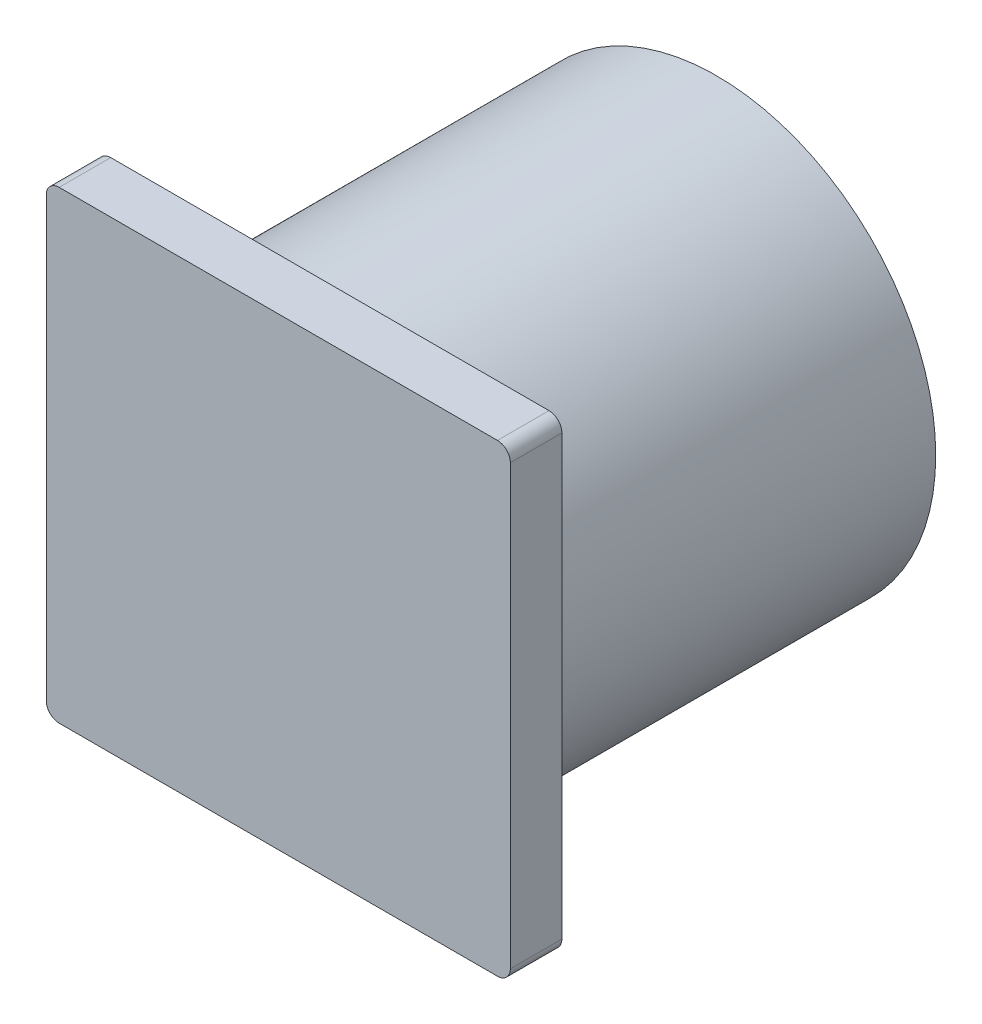
ISO-10303-21;
HEADER;
FILE_DESCRIPTION(('STEP AP214'),'2;1');
FILE_NAME('part.step','',(''),(''),'','','');
FILE_SCHEMA(('AUTOMOTIVE_DESIGN { 1 0 10303 214 1 1 1 1 }'));
ENDSEC;
DATA;
#1=APPLICATION_CONTEXT('core data for automotive mechanical design processes');
#2=APPLICATION_PROTOCOL_DEFINITION('international standard','automotive_design',2000,#1);
#3=PRODUCT_CONTEXT('',#1,'mechanical');
#4=PRODUCT('Part','Part','',(#3));
#5=PRODUCT_RELATED_PRODUCT_CATEGORY('part','',(#4));
#6=PRODUCT_DEFINITION_FORMATION('','',#4);
#7=PRODUCT_DEFINITION_CONTEXT('part definition',#1,'design');
#8=PRODUCT_DEFINITION('design','',#6,#7);
#9=PRODUCT_DEFINITION_SHAPE('','',#8);
#10=(LENGTH_UNIT() NAMED_UNIT(*) SI_UNIT(.MILLI.,.METRE.));
#11=(NAMED_UNIT(*) PLANE_ANGLE_UNIT() SI_UNIT($,.RADIAN.));
#12=(NAMED_UNIT(*) SI_UNIT($,.STERADIAN.) SOLID_ANGLE_UNIT());
#13=UNCERTAINTY_MEASURE_WITH_UNIT(LENGTH_MEASURE(1.E-05),#10,'distance_accuracy_value','');
#14=(GEOMETRIC_REPRESENTATION_CONTEXT(3) GLOBAL_UNCERTAINTY_ASSIGNED_CONTEXT((#13)) GLOBAL_UNIT_ASSIGNED_CONTEXT((#10,
#11,#12)) REPRESENTATION_CONTEXT('',''));
#15=CARTESIAN_POINT('',(0.,0.,0.));
#16=DIRECTION('',(0.,0.,1.));
#17=DIRECTION('',(1.,0.,0.));
#18=AXIS2_PLACEMENT_3D('',#15,#16,#17);
#19=CARTESIAN_POINT('',(0.,0.,150.));
#20=DIRECTION('',(0.,0.,1.));
#21=DIRECTION('',(1.,0.,0.));
#22=AXIS2_PLACEMENT_3D('',#19,#20,#21);
#23=PLANE('',#22);
#24=DIRECTION('',(-1.,0.,0.));
#25=VECTOR('',#24,1.);
#26=CARTESIAN_POINT('',(-90.,90.,150.));
#27=LINE('',#26,#25);
#28=CARTESIAN_POINT('',(84.9999999999999,90.,150.));
#29=VERTEX_POINT('',#28);
#30=CARTESIAN_POINT('',(0.,90.,150.));
#31=VERTEX_POINT('',#30);
#32=EDGE_CURVE('E197',#29,#31,#27,.T.);
#33=ORIENTED_EDGE('',*,*,#32,.F.);
#34=CARTESIAN_POINT('',(85.,85.,150.));
#35=DIRECTION('',(0.,0.,1.));
#36=DIRECTION('',(1.,0.,0.));
#37=AXIS2_PLACEMENT_3D('',#34,#35,#36);
#38=CIRCLE('',#37,5.);
#39=CARTESIAN_POINT('',(90.,85.,150.));
#40=VERTEX_POINT('',#39);
#41=EDGE_CURVE('E174',#29,#40,#38,.F.);
#42=ORIENTED_EDGE('',*,*,#41,.T.);
#43=DIRECTION('',(0.,1.,0.));
#44=VECTOR('',#43,1.);
#45=CARTESIAN_POINT('',(90.,90.,150.));
#46=LINE('',#45,#44);
#47=CARTESIAN_POINT('',(90.,0.,150.));
#48=VERTEX_POINT('',#47);
#49=EDGE_CURVE('E195',#48,#40,#46,.T.);
#50=ORIENTED_EDGE('',*,*,#49,.F.);
#51=CARTESIAN_POINT('',(0.,0.,150.));
#52=DIRECTION('',(0.,0.,1.));
#53=DIRECTION('',(1.,0.,0.));
#54=AXIS2_PLACEMENT_3D('',#51,#52,#53);
#55=CIRCLE('',#54,90.);
#56=EDGE_CURVE('E134',#48,#31,#55,.T.);
#57=ORIENTED_EDGE('',*,*,#56,.T.);
#58=EDGE_LOOP('',(#33,#42,#50,#57));
#59=FACE_BOUND('',#58,.T.);
#60=ADVANCED_FACE('F34',(#59),#23,.F.);
#61=DIRECTION('',(0.,-1.,0.));
#62=VECTOR('',#61,1.);
#63=CARTESIAN_POINT('',(-90.,90.,150.));
#64=LINE('',#63,#62);
#65=CARTESIAN_POINT('',(-90.,85.,150.));
#66=VERTEX_POINT('',#65);
#67=CARTESIAN_POINT('',(-90.,0.,150.));
#68=VERTEX_POINT('',#67);
#69=EDGE_CURVE('E112',#66,#68,#64,.T.);
#70=ORIENTED_EDGE('',*,*,#69,.F.);
#71=CARTESIAN_POINT('',(-85.,85.,150.));
#72=DIRECTION('',(0.,0.,1.));
#73=DIRECTION('',(1.,0.,0.));
#74=AXIS2_PLACEMENT_3D('',#71,#72,#73);
#75=CIRCLE('',#74,5.);
#76=CARTESIAN_POINT('',(-85.,90.,150.));
#77=VERTEX_POINT('',#76);
#78=EDGE_CURVE('E156',#66,#77,#75,.F.);
#79=ORIENTED_EDGE('',*,*,#78,.T.);
#80=EDGE_CURVE('E129',#31,#77,#27,.T.);
#81=ORIENTED_EDGE('',*,*,#80,.F.);
#82=CARTESIAN_POINT('',(0.,0.,150.));
#83=DIRECTION('',(0.,0.,1.));
#84=DIRECTION('',(1.,0.,0.));
#85=AXIS2_PLACEMENT_3D('',#82,#83,#84);
#86=CIRCLE('',#85,90.);
#87=EDGE_CURVE('E126',#31,#68,#86,.T.);
#88=ORIENTED_EDGE('',*,*,#87,.T.);
#89=EDGE_LOOP('',(#70,#79,#81,#88));
#90=FACE_BOUND('',#89,.T.);
#91=ADVANCED_FACE('F127',(#90),#23,.F.);
#92=DIRECTION('',(1.,0.,0.));
#93=VECTOR('',#92,1.);
#94=CARTESIAN_POINT('',(-89.9999999999999,-90.,150.));
#95=LINE('',#94,#93);
#96=CARTESIAN_POINT('',(-84.9999999999999,-90.,150.));
#97=VERTEX_POINT('',#96);
#98=CARTESIAN_POINT('',(0.,-90.,150.));
#99=VERTEX_POINT('',#98);
#100=EDGE_CURVE('E199',#97,#99,#95,.T.);
#101=ORIENTED_EDGE('',*,*,#100,.F.);
#102=CARTESIAN_POINT('',(-84.9999999999999,-85.,150.));
#103=DIRECTION('',(0.,0.,1.));
#104=DIRECTION('',(1.,0.,0.));
#105=AXIS2_PLACEMENT_3D('',#102,#103,#104);
#106=CIRCLE('',#105,5.);
#107=CARTESIAN_POINT('',(-89.9999999999999,-85.,150.));
#108=VERTEX_POINT('',#107);
#109=EDGE_CURVE('E141',#97,#108,#106,.F.);
#110=ORIENTED_EDGE('',*,*,#109,.T.);
#111=EDGE_CURVE('E116',#68,#108,#64,.T.);
#112=ORIENTED_EDGE('',*,*,#111,.F.);
#113=CARTESIAN_POINT('',(0.,0.,150.));
#114=DIRECTION('',(0.,0.,1.));
#115=DIRECTION('',(1.,0.,0.));
#116=AXIS2_PLACEMENT_3D('',#113,#114,#115);
#117=CIRCLE('',#116,90.);
#118=EDGE_CURVE('E135',#68,#99,#117,.T.);
#119=ORIENTED_EDGE('',*,*,#118,.T.);
#120=EDGE_LOOP('',(#101,#110,#112,#119));
#121=FACE_BOUND('',#120,.T.);
#122=ADVANCED_FACE('F140',(#121),#23,.F.);
#123=CARTESIAN_POINT('',(0.,0.,150.));
#124=DIRECTION('',(0.,0.,-1.));
#125=DIRECTION('',(-1.,0.,0.));
#126=AXIS2_PLACEMENT_3D('',#123,#124,#125);
#127=CYLINDRICAL_SURFACE('',#126,85.);
#128=CARTESIAN_POINT('',(0.,0.,145.));
#129=DIRECTION('',(0.,0.,1.));
#130=DIRECTION('',(1.,0.,0.));
#131=AXIS2_PLACEMENT_3D('',#128,#129,#130);
#132=CIRCLE('',#131,85.);
#133=CARTESIAN_POINT('',(85.,0.,145.));
#134=VERTEX_POINT('',#133);
#135=EDGE_CURVE('E152',#134,#134,#132,.F.);
#136=ORIENTED_EDGE('',*,*,#135,.T.);
#137=EDGE_LOOP('',(#136));
#138=FACE_BOUND('',#137,.T.);
#139=CARTESIAN_POINT('',(0.,0.,0.));
#140=DIRECTION('',(0.,0.,1.));
#141=DIRECTION('',(1.,0.,0.));
#142=AXIS2_PLACEMENT_3D('',#139,#140,#141);
#143=CIRCLE('',#142,85.);
#144=CARTESIAN_POINT('',(85.,0.,0.));
#145=VERTEX_POINT('',#144);
#146=EDGE_CURVE('E147',#145,#145,#143,.T.);
#147=ORIENTED_EDGE('',*,*,#146,.T.);
#148=EDGE_LOOP('',(#147));
#149=FACE_BOUND('',#148,.T.);
#150=ADVANCED_FACE('F246',(#138,#149),#127,.T.);
#151=CARTESIAN_POINT('',(0.,0.,0.));
#152=DIRECTION('',(0.,0.,1.));
#153=DIRECTION('',(1.,0.,0.));
#154=AXIS2_PLACEMENT_3D('',#151,#152,#153);
#155=PLANE('',#154);
#156=ORIENTED_EDGE('',*,*,#146,.F.);
#157=EDGE_LOOP('',(#156));
#158=FACE_BOUND('',#157,.T.);
#159=ADVANCED_FACE('F250',(#158),#155,.F.);
#160=CARTESIAN_POINT('',(-90.,90.,170.));
#161=DIRECTION('',(1.,0.,0.));
#162=DIRECTION('',(0.,1.,0.));
#163=AXIS2_PLACEMENT_3D('',#160,#161,#162);
#164=PLANE('',#163);
#165=ORIENTED_EDGE('',*,*,#111,.T.);
#166=DIRECTION('',(0.,0.,-1.));
#167=VECTOR('',#166,1.);
#168=CARTESIAN_POINT('',(-89.9999999999999,-85.,170.));
#169=LINE('',#168,#167);
#170=CARTESIAN_POINT('',(-89.9999999999999,-85.,170.));
#171=VERTEX_POINT('',#170);
#172=EDGE_CURVE('E167',#108,#171,#169,.F.);
#173=ORIENTED_EDGE('',*,*,#172,.T.);
#174=DIRECTION('',(0.,-1.,0.));
#175=VECTOR('',#174,1.);
#176=CARTESIAN_POINT('',(-90.,90.,170.));
#177=LINE('',#176,#175);
#178=CARTESIAN_POINT('',(-90.,85.,170.));
#179=VERTEX_POINT('',#178);
#180=EDGE_CURVE('E201',#179,#171,#177,.T.);
#181=ORIENTED_EDGE('',*,*,#180,.F.);
#182=DIRECTION('',(0.,0.,-1.));
#183=VECTOR('',#182,1.);
#184=CARTESIAN_POINT('',(-90.,85.,170.));
#185=LINE('',#184,#183);
#186=EDGE_CURVE('E120',#179,#66,#185,.T.);
#187=ORIENTED_EDGE('',*,*,#186,.T.);
#188=ORIENTED_EDGE('',*,*,#69,.T.);
#189=EDGE_LOOP('',(#165,#173,#181,#187,#188));
#190=FACE_BOUND('',#189,.T.);
#191=ADVANCED_FACE('F114',(#190),#164,.F.);
#192=CARTESIAN_POINT('',(-89.9999999999999,-90.,170.));
#193=DIRECTION('',(0.,1.,0.));
#194=DIRECTION('',(-1.,0.,0.));
#195=AXIS2_PLACEMENT_3D('',#192,#193,#194);
#196=PLANE('',#195);
#197=CARTESIAN_POINT('',(84.9999999999999,-90.,150.));
#198=VERTEX_POINT('',#197);
#199=EDGE_CURVE('E122',#99,#198,#95,.T.);
#200=ORIENTED_EDGE('',*,*,#199,.T.);
#201=DIRECTION('',(0.,0.,-1.));
#202=VECTOR('',#201,1.);
#203=CARTESIAN_POINT('',(85.,-90.,170.));
#204=LINE('',#203,#202);
#205=CARTESIAN_POINT('',(84.9999999999999,-90.,170.));
#206=VERTEX_POINT('',#205);
#207=EDGE_CURVE('E42',#198,#206,#204,.F.);
#208=ORIENTED_EDGE('',*,*,#207,.T.);
#209=DIRECTION('',(1.,0.,0.));
#210=VECTOR('',#209,1.);
#211=CARTESIAN_POINT('',(-89.9999999999999,-90.,170.));
#212=LINE('',#211,#210);
#213=CARTESIAN_POINT('',(-84.9999999999999,-90.,170.));
#214=VERTEX_POINT('',#213);
#215=EDGE_CURVE('E209',#214,#206,#212,.T.);
#216=ORIENTED_EDGE('',*,*,#215,.F.);
#217=DIRECTION('',(0.,0.,-1.));
#218=VECTOR('',#217,1.);
#219=CARTESIAN_POINT('',(-84.9999999999999,-90.,170.));
#220=LINE('',#219,#218);
#221=EDGE_CURVE('E163',#214,#97,#220,.T.);
#222=ORIENTED_EDGE('',*,*,#221,.T.);
#223=ORIENTED_EDGE('',*,*,#100,.T.);
#224=EDGE_LOOP('',(#200,#208,#216,#222,#223));
#225=FACE_BOUND('',#224,.T.);
#226=ADVANCED_FACE('F220',(#225),#196,.F.);
#227=CARTESIAN_POINT('',(90.,90.,170.));
#228=DIRECTION('',(-1.,0.,0.));
#229=DIRECTION('',(0.,-1.,0.));
#230=AXIS2_PLACEMENT_3D('',#227,#228,#229);
#231=PLANE('',#230);
#232=DIRECTION('',(0.,1.,0.));
#233=VECTOR('',#232,1.);
#234=CARTESIAN_POINT('',(90.,90.,170.));
#235=LINE('',#234,#233);
#236=CARTESIAN_POINT('',(90.,-84.9999999999999,170.));
#237=VERTEX_POINT('',#236);
#238=CARTESIAN_POINT('',(90.,85.,170.));
#239=VERTEX_POINT('',#238);
#240=EDGE_CURVE('E190',#237,#239,#235,.T.);
#241=ORIENTED_EDGE('',*,*,#240,.F.);
#242=DIRECTION('',(0.,0.,-1.));
#243=VECTOR('',#242,1.);
#244=CARTESIAN_POINT('',(90.,-85.,170.));
#245=LINE('',#244,#243);
#246=CARTESIAN_POINT('',(90.,-84.9999999999999,150.));
#247=VERTEX_POINT('',#246);
#248=EDGE_CURVE('E181',#237,#247,#245,.T.);
#249=ORIENTED_EDGE('',*,*,#248,.T.);
#250=EDGE_CURVE('E189',#247,#48,#46,.T.);
#251=ORIENTED_EDGE('',*,*,#250,.T.);
#252=ORIENTED_EDGE('',*,*,#49,.T.);
#253=DIRECTION('',(0.,0.,-1.));
#254=VECTOR('',#253,1.);
#255=CARTESIAN_POINT('',(90.,85.,170.));
#256=LINE('',#255,#254);
#257=EDGE_CURVE('E176',#40,#239,#256,.F.);
#258=ORIENTED_EDGE('',*,*,#257,.T.);
#259=EDGE_LOOP('',(#241,#249,#251,#252,#258));
#260=FACE_BOUND('',#259,.T.);
#261=ADVANCED_FACE('F187',(#260),#231,.F.);
#262=CARTESIAN_POINT('',(-90.,90.,170.));
#263=DIRECTION('',(0.,-1.,0.));
#264=DIRECTION('',(1.,0.,0.));
#265=AXIS2_PLACEMENT_3D('',#262,#263,#264);
#266=PLANE('',#265);
#267=DIRECTION('',(-1.,0.,0.));
#268=VECTOR('',#267,1.);
#269=CARTESIAN_POINT('',(-90.,90.,170.));
#270=LINE('',#269,#268);
#271=CARTESIAN_POINT('',(84.9999999999999,90.,170.));
#272=VERTEX_POINT('',#271);
#273=CARTESIAN_POINT('',(-85.,90.,170.));
#274=VERTEX_POINT('',#273);
#275=EDGE_CURVE('E203',#272,#274,#270,.T.);
#276=ORIENTED_EDGE('',*,*,#275,.F.);
#277=DIRECTION('',(0.,0.,-1.));
#278=VECTOR('',#277,1.);
#279=CARTESIAN_POINT('',(85.,90.,170.));
#280=LINE('',#279,#278);
#281=EDGE_CURVE('E171',#272,#29,#280,.T.);
#282=ORIENTED_EDGE('',*,*,#281,.T.);
#283=ORIENTED_EDGE('',*,*,#32,.T.);
#284=ORIENTED_EDGE('',*,*,#80,.T.);
#285=DIRECTION('',(0.,0.,-1.));
#286=VECTOR('',#285,1.);
#287=CARTESIAN_POINT('',(-85.,90.,170.));
#288=LINE('',#287,#286);
#289=EDGE_CURVE('E158',#77,#274,#288,.F.);
#290=ORIENTED_EDGE('',*,*,#289,.T.);
#291=EDGE_LOOP('',(#276,#282,#283,#284,#290));
#292=FACE_BOUND('',#291,.T.);
#293=ADVANCED_FACE('F228',(#292),#266,.F.);
#294=CARTESIAN_POINT('',(0.,0.,170.));
#295=DIRECTION('',(0.,0.,1.));
#296=DIRECTION('',(1.,0.,0.));
#297=AXIS2_PLACEMENT_3D('',#294,#295,#296);
#298=PLANE('',#297);
#299=ORIENTED_EDGE('',*,*,#215,.T.);
#300=CARTESIAN_POINT('',(85.,-85.,170.));
#301=DIRECTION('',(0.,0.,1.));
#302=DIRECTION('',(1.,0.,0.));
#303=AXIS2_PLACEMENT_3D('',#300,#301,#302);
#304=CIRCLE('',#303,5.);
#305=EDGE_CURVE('E11',#206,#237,#304,.T.);
#306=ORIENTED_EDGE('',*,*,#305,.T.);
#307=ORIENTED_EDGE('',*,*,#240,.T.);
#308=CARTESIAN_POINT('',(85.,85.,170.));
#309=DIRECTION('',(0.,0.,1.));
#310=DIRECTION('',(1.,0.,0.));
#311=AXIS2_PLACEMENT_3D('',#308,#309,#310);
#312=CIRCLE('',#311,5.);
#313=EDGE_CURVE('E179',#239,#272,#312,.T.);
#314=ORIENTED_EDGE('',*,*,#313,.T.);
#315=ORIENTED_EDGE('',*,*,#275,.T.);
#316=CARTESIAN_POINT('',(-85.,85.,170.));
#317=DIRECTION('',(0.,0.,1.));
#318=DIRECTION('',(1.,0.,0.));
#319=AXIS2_PLACEMENT_3D('',#316,#317,#318);
#320=CIRCLE('',#319,5.);
#321=EDGE_CURVE('E161',#274,#179,#320,.T.);
#322=ORIENTED_EDGE('',*,*,#321,.T.);
#323=ORIENTED_EDGE('',*,*,#180,.T.);
#324=CARTESIAN_POINT('',(-84.9999999999999,-85.,170.));
#325=DIRECTION('',(0.,0.,1.));
#326=DIRECTION('',(1.,0.,0.));
#327=AXIS2_PLACEMENT_3D('',#324,#325,#326);
#328=CIRCLE('',#327,5.);
#329=EDGE_CURVE('E169',#171,#214,#328,.T.);
#330=ORIENTED_EDGE('',*,*,#329,.T.);
#331=EDGE_LOOP('',(#299,#306,#307,#314,#315,#322,#323,#330));
#332=FACE_BOUND('',#331,.T.);
#333=ADVANCED_FACE('F215',(#332),#298,.T.);
#334=ORIENTED_EDGE('',*,*,#250,.F.);
#335=CARTESIAN_POINT('',(85.,-85.,150.));
#336=DIRECTION('',(0.,0.,1.));
#337=DIRECTION('',(1.,0.,0.));
#338=AXIS2_PLACEMENT_3D('',#335,#336,#337);
#339=CIRCLE('',#338,5.);
#340=EDGE_CURVE('E56',#247,#198,#339,.F.);
#341=ORIENTED_EDGE('',*,*,#340,.T.);
#342=ORIENTED_EDGE('',*,*,#199,.F.);
#343=CARTESIAN_POINT('',(0.,0.,150.));
#344=DIRECTION('',(0.,0.,1.));
#345=DIRECTION('',(1.,0.,0.));
#346=AXIS2_PLACEMENT_3D('',#343,#344,#345);
#347=CIRCLE('',#346,90.);
#348=EDGE_CURVE('E145',#99,#48,#347,.T.);
#349=ORIENTED_EDGE('',*,*,#348,.T.);
#350=EDGE_LOOP('',(#334,#341,#342,#349));
#351=FACE_BOUND('',#350,.T.);
#352=ADVANCED_FACE('F193',(#351),#23,.F.);
#353=CARTESIAN_POINT('',(0.,0.,145.));
#354=DIRECTION('',(0.,0.,1.));
#355=DIRECTION('',(1.,0.,0.));
#356=AXIS2_PLACEMENT_3D('',#353,#354,#355);
#357=TOROIDAL_SURFACE('',#356,90.,5.);
#358=ORIENTED_EDGE('',*,*,#135,.F.);
#359=EDGE_LOOP('',(#358));
#360=FACE_BOUND('',#359,.T.);
#361=ORIENTED_EDGE('',*,*,#87,.F.);
#362=ORIENTED_EDGE('',*,*,#56,.F.);
#363=ORIENTED_EDGE('',*,*,#348,.F.);
#364=ORIENTED_EDGE('',*,*,#118,.F.);
#365=EDGE_LOOP('',(#361,#362,#363,#364));
#366=FACE_BOUND('',#365,.T.);
#367=ADVANCED_FACE('F143',(#360,#366),#357,.F.);
#368=CARTESIAN_POINT('',(-85.,85.,170.));
#369=DIRECTION('',(0.,0.,-1.));
#370=DIRECTION('',(-1.,0.,0.));
#371=AXIS2_PLACEMENT_3D('',#368,#369,#370);
#372=CYLINDRICAL_SURFACE('',#371,5.);
#373=ORIENTED_EDGE('',*,*,#321,.F.);
#374=ORIENTED_EDGE('',*,*,#289,.F.);
#375=ORIENTED_EDGE('',*,*,#78,.F.);
#376=ORIENTED_EDGE('',*,*,#186,.F.);
#377=EDGE_LOOP('',(#373,#374,#375,#376));
#378=FACE_BOUND('',#377,.T.);
#379=ADVANCED_FACE('F242',(#378),#372,.T.);
#380=CARTESIAN_POINT('',(-84.9999999999999,-85.,170.));
#381=DIRECTION('',(0.,0.,-1.));
#382=DIRECTION('',(-1.,0.,0.));
#383=AXIS2_PLACEMENT_3D('',#380,#381,#382);
#384=CYLINDRICAL_SURFACE('',#383,5.);
#385=ORIENTED_EDGE('',*,*,#329,.F.);
#386=ORIENTED_EDGE('',*,*,#172,.F.);
#387=ORIENTED_EDGE('',*,*,#109,.F.);
#388=ORIENTED_EDGE('',*,*,#221,.F.);
#389=EDGE_LOOP('',(#385,#386,#387,#388));
#390=FACE_BOUND('',#389,.T.);
#391=ADVANCED_FACE('F219',(#390),#384,.T.);
#392=CARTESIAN_POINT('',(85.,85.,170.));
#393=DIRECTION('',(0.,0.,-1.));
#394=DIRECTION('',(-1.,0.,0.));
#395=AXIS2_PLACEMENT_3D('',#392,#393,#394);
#396=CYLINDRICAL_SURFACE('',#395,5.);
#397=ORIENTED_EDGE('',*,*,#313,.F.);
#398=ORIENTED_EDGE('',*,*,#257,.F.);
#399=ORIENTED_EDGE('',*,*,#41,.F.);
#400=ORIENTED_EDGE('',*,*,#281,.F.);
#401=EDGE_LOOP('',(#397,#398,#399,#400));
#402=FACE_BOUND('',#401,.T.);
#403=ADVANCED_FACE('F225',(#402),#396,.T.);
#404=CARTESIAN_POINT('',(85.,-85.,170.));
#405=DIRECTION('',(0.,0.,-1.));
#406=DIRECTION('',(-1.,0.,0.));
#407=AXIS2_PLACEMENT_3D('',#404,#405,#406);
#408=CYLINDRICAL_SURFACE('',#407,5.);
#409=ORIENTED_EDGE('',*,*,#305,.F.);
#410=ORIENTED_EDGE('',*,*,#207,.F.);
#411=ORIENTED_EDGE('',*,*,#340,.F.);
#412=ORIENTED_EDGE('',*,*,#248,.F.);
#413=EDGE_LOOP('',(#409,#410,#411,#412));
#414=FACE_BOUND('',#413,.T.);
#415=ADVANCED_FACE('F36',(#414),#408,.T.);
#416=CLOSED_SHELL('',(#60,#91,#122,#150,#159,#191,#226,#261,#293,#333,#352,#367,#379,#391,#403,#415));
#417=MANIFOLD_SOLID_BREP('B2',#416);
#418=ADVANCED_BREP_SHAPE_REPRESENTATION('',(#18,#417),#14);
#419=SHAPE_DEFINITION_REPRESENTATION(#9,#418);
ENDSEC;
END-ISO-10303-21;
